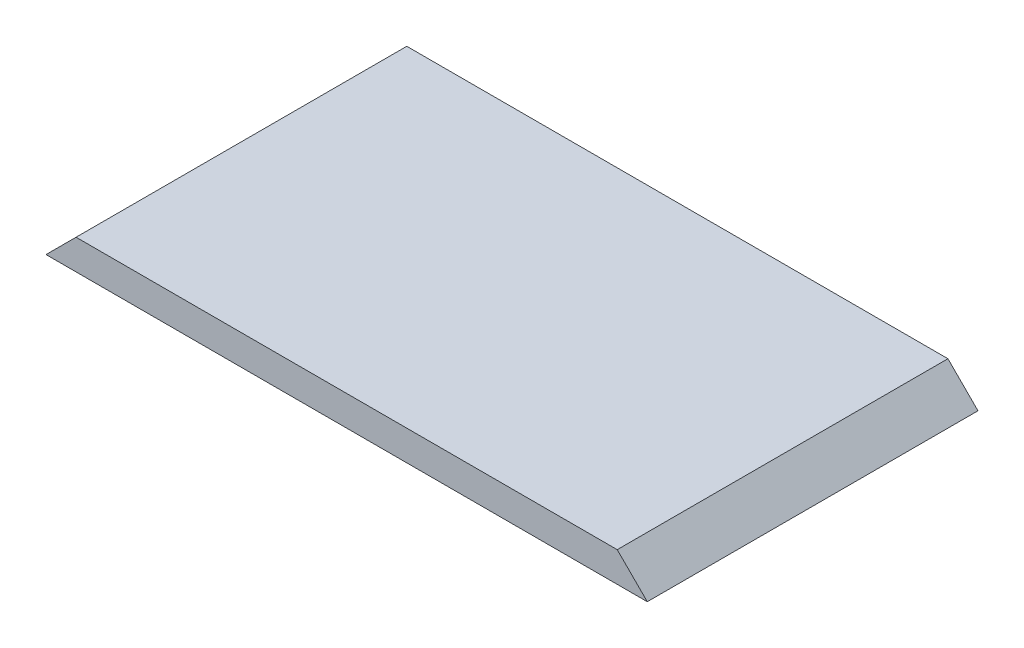
ISO-10303-21;
HEADER;
FILE_DESCRIPTION(('STEP AP214'),'2;1');
FILE_NAME('part.step','',(''),(''),'','','');
FILE_SCHEMA(('AUTOMOTIVE_DESIGN { 1 0 10303 214 1 1 1 1 }'));
ENDSEC;
DATA;
#1=APPLICATION_CONTEXT('core data for automotive mechanical design processes');
#2=APPLICATION_PROTOCOL_DEFINITION('international standard','automotive_design',2000,#1);
#3=PRODUCT_CONTEXT('',#1,'mechanical');
#4=PRODUCT('Part','Part','',(#3));
#5=PRODUCT_RELATED_PRODUCT_CATEGORY('part','',(#4));
#6=PRODUCT_DEFINITION_FORMATION('','',#4);
#7=PRODUCT_DEFINITION_CONTEXT('part definition',#1,'design');
#8=PRODUCT_DEFINITION('design','',#6,#7);
#9=PRODUCT_DEFINITION_SHAPE('','',#8);
#10=(LENGTH_UNIT() NAMED_UNIT(*) SI_UNIT(.MILLI.,.METRE.));
#11=(NAMED_UNIT(*) PLANE_ANGLE_UNIT() SI_UNIT($,.RADIAN.));
#12=(NAMED_UNIT(*) SI_UNIT($,.STERADIAN.) SOLID_ANGLE_UNIT());
#13=UNCERTAINTY_MEASURE_WITH_UNIT(LENGTH_MEASURE(1.E-05),#10,'distance_accuracy_value','');
#14=(GEOMETRIC_REPRESENTATION_CONTEXT(3) GLOBAL_UNCERTAINTY_ASSIGNED_CONTEXT((#13)) GLOBAL_UNIT_ASSIGNED_CONTEXT((#10,
#11,#12)) REPRESENTATION_CONTEXT('',''));
#15=CARTESIAN_POINT('',(0.,0.,0.));
#16=DIRECTION('',(0.,0.,1.));
#17=DIRECTION('',(1.,0.,0.));
#18=AXIS2_PLACEMENT_3D('',#15,#16,#17);
#19=CARTESIAN_POINT('',(0.,5.,-55.));
#20=DIRECTION('',(0.,0.,1.));
#21=DIRECTION('',(1.,0.,0.));
#22=AXIS2_PLACEMENT_3D('',#19,#20,#21);
#23=PLANE('',#22);
#24=DIRECTION('',(-1.,0.,0.));
#25=VECTOR('',#24,1.);
#26=CARTESIAN_POINT('',(0.,0.,-55.));
#27=LINE('',#26,#25);
#28=CARTESIAN_POINT('',(0.,0.,-55.));
#29=VERTEX_POINT('',#28);
#30=CARTESIAN_POINT('',(-100.,0.,-55.));
#31=VERTEX_POINT('',#30);
#32=EDGE_CURVE('E81',#29,#31,#27,.T.);
#33=ORIENTED_EDGE('',*,*,#32,.T.);
#34=DIRECTION('',(0.707106781186546,0.707106781186549,0.));
#35=VECTOR('',#34,1.);
#36=CARTESIAN_POINT('',(-47.5000000000003,52.5,-55.));
#37=LINE('',#36,#35);
#38=CARTESIAN_POINT('',(-95.,5.,-55.));
#39=VERTEX_POINT('',#38);
#40=EDGE_CURVE('E57',#31,#39,#37,.T.);
#41=ORIENTED_EDGE('',*,*,#40,.T.);
#42=DIRECTION('',(-1.,0.,0.));
#43=VECTOR('',#42,1.);
#44=CARTESIAN_POINT('',(0.,5.,-55.));
#45=LINE('',#44,#43);
#46=CARTESIAN_POINT('',(-5.00000000000006,5.,-55.));
#47=VERTEX_POINT('',#46);
#48=EDGE_CURVE('E41',#47,#39,#45,.T.);
#49=ORIENTED_EDGE('',*,*,#48,.F.);
#50=DIRECTION('',(-0.707106781186551,0.707106781186544,0.));
#51=VECTOR('',#50,1.);
#52=CARTESIAN_POINT('',(0.,0.,-55.));
#53=LINE('',#52,#51);
#54=EDGE_CURVE('E102',#29,#47,#53,.T.);
#55=ORIENTED_EDGE('',*,*,#54,.F.);
#56=EDGE_LOOP('',(#33,#41,#49,#55));
#57=FACE_BOUND('',#56,.T.);
#58=ADVANCED_FACE('F33',(#57),#23,.F.);
#59=CARTESIAN_POINT('',(0.,5.,0.));
#60=DIRECTION('',(0.,0.,-1.));
#61=DIRECTION('',(-1.,0.,0.));
#62=AXIS2_PLACEMENT_3D('',#59,#60,#61);
#63=PLANE('',#62);
#64=DIRECTION('',(1.,0.,0.));
#65=VECTOR('',#64,1.);
#66=CARTESIAN_POINT('',(0.,5.,0.));
#67=LINE('',#66,#65);
#68=CARTESIAN_POINT('',(-95.,5.,0.));
#69=VERTEX_POINT('',#68);
#70=CARTESIAN_POINT('',(-5.00000000000006,5.,0.));
#71=VERTEX_POINT('',#70);
#72=EDGE_CURVE('E11',#69,#71,#67,.T.);
#73=ORIENTED_EDGE('',*,*,#72,.F.);
#74=DIRECTION('',(0.707106781186546,0.707106781186549,0.));
#75=VECTOR('',#74,1.);
#76=CARTESIAN_POINT('',(-100.,0.,0.));
#77=LINE('',#76,#75);
#78=CARTESIAN_POINT('',(-100.,0.,0.));
#79=VERTEX_POINT('',#78);
#80=EDGE_CURVE('E76',#79,#69,#77,.T.);
#81=ORIENTED_EDGE('',*,*,#80,.F.);
#82=DIRECTION('',(1.,0.,0.));
#83=VECTOR('',#82,1.);
#84=CARTESIAN_POINT('',(0.,0.,0.));
#85=LINE('',#84,#83);
#86=CARTESIAN_POINT('',(0.,0.,0.));
#87=VERTEX_POINT('',#86);
#88=EDGE_CURVE('E36',#79,#87,#85,.T.);
#89=ORIENTED_EDGE('',*,*,#88,.T.);
#90=DIRECTION('',(0.707106781186551,-0.707106781186544,0.));
#91=VECTOR('',#90,1.);
#92=CARTESIAN_POINT('',(0.,0.,0.));
#93=LINE('',#92,#91);
#94=EDGE_CURVE('E49',#71,#87,#93,.T.);
#95=ORIENTED_EDGE('',*,*,#94,.F.);
#96=EDGE_LOOP('',(#73,#81,#89,#95));
#97=FACE_BOUND('',#96,.T.);
#98=ADVANCED_FACE('F84',(#97),#63,.F.);
#99=CARTESIAN_POINT('',(0.,5.,0.));
#100=DIRECTION('',(0.,1.,0.));
#101=DIRECTION('',(0.,0.,1.));
#102=AXIS2_PLACEMENT_3D('',#99,#100,#101);
#103=PLANE('',#102);
#104=DIRECTION('',(0.,0.,1.));
#105=VECTOR('',#104,1.);
#106=CARTESIAN_POINT('',(-95.,5.,-66.));
#107=LINE('',#106,#105);
#108=EDGE_CURVE('E86',#39,#69,#107,.T.);
#109=ORIENTED_EDGE('',*,*,#108,.T.);
#110=ORIENTED_EDGE('',*,*,#72,.T.);
#111=DIRECTION('',(0.,0.,1.));
#112=VECTOR('',#111,1.);
#113=CARTESIAN_POINT('',(-5.00000000000006,5.,-55.001));
#114=LINE('',#113,#112);
#115=EDGE_CURVE('E96',#47,#71,#114,.T.);
#116=ORIENTED_EDGE('',*,*,#115,.F.);
#117=ORIENTED_EDGE('',*,*,#48,.T.);
#118=EDGE_LOOP('',(#109,#110,#116,#117));
#119=FACE_BOUND('',#118,.T.);
#120=ADVANCED_FACE('F106',(#119),#103,.T.);
#121=CARTESIAN_POINT('',(0.,0.,0.));
#122=DIRECTION('',(0.,1.,0.));
#123=DIRECTION('',(0.,0.,1.));
#124=AXIS2_PLACEMENT_3D('',#121,#122,#123);
#125=PLANE('',#124);
#126=DIRECTION('',(0.,0.,-1.));
#127=VECTOR('',#126,1.);
#128=CARTESIAN_POINT('',(0.,0.,0.));
#129=LINE('',#128,#127);
#130=EDGE_CURVE('E89',#87,#29,#129,.T.);
#131=ORIENTED_EDGE('',*,*,#130,.F.);
#132=ORIENTED_EDGE('',*,*,#88,.F.);
#133=DIRECTION('',(0.,0.,1.));
#134=VECTOR('',#133,1.);
#135=CARTESIAN_POINT('',(-100.,0.,0.));
#136=LINE('',#135,#134);
#137=EDGE_CURVE('E73',#31,#79,#136,.T.);
#138=ORIENTED_EDGE('',*,*,#137,.F.);
#139=ORIENTED_EDGE('',*,*,#32,.F.);
#140=EDGE_LOOP('',(#131,#132,#138,#139));
#141=FACE_BOUND('',#140,.T.);
#142=ADVANCED_FACE('F88',(#141),#125,.F.);
#143=CARTESIAN_POINT('',(0.,0.,-55.001));
#144=DIRECTION('',(-0.707106781186544,-0.707106781186551,0.));
#145=DIRECTION('',(0.707106781186551,-0.707106781186544,0.));
#146=AXIS2_PLACEMENT_3D('',#143,#144,#145);
#147=PLANE('',#146);
#148=ORIENTED_EDGE('',*,*,#54,.T.);
#149=ORIENTED_EDGE('',*,*,#115,.T.);
#150=ORIENTED_EDGE('',*,*,#94,.T.);
#151=ORIENTED_EDGE('',*,*,#130,.T.);
#152=EDGE_LOOP('',(#148,#149,#150,#151));
#153=FACE_BOUND('',#152,.T.);
#154=ADVANCED_FACE('F107',(#153),#147,.F.);
#155=CARTESIAN_POINT('',(-100.,0.,-66.));
#156=DIRECTION('',(0.707106781186549,-0.707106781186546,0.));
#157=DIRECTION('',(0.707106781186546,0.707106781186549,0.));
#158=AXIS2_PLACEMENT_3D('',#155,#156,#157);
#159=PLANE('',#158);
#160=ORIENTED_EDGE('',*,*,#137,.T.);
#161=ORIENTED_EDGE('',*,*,#80,.T.);
#162=ORIENTED_EDGE('',*,*,#108,.F.);
#163=ORIENTED_EDGE('',*,*,#40,.F.);
#164=EDGE_LOOP('',(#160,#161,#162,#163));
#165=FACE_BOUND('',#164,.T.);
#166=ADVANCED_FACE('F75',(#165),#159,.F.);
#167=CLOSED_SHELL('',(#58,#98,#120,#142,#154,#166));
#168=MANIFOLD_SOLID_BREP('B2',#167);
#169=ADVANCED_BREP_SHAPE_REPRESENTATION('',(#18,#168),#14);
#170=SHAPE_DEFINITION_REPRESENTATION(#9,#169);
ENDSEC;
END-ISO-10303-21;
